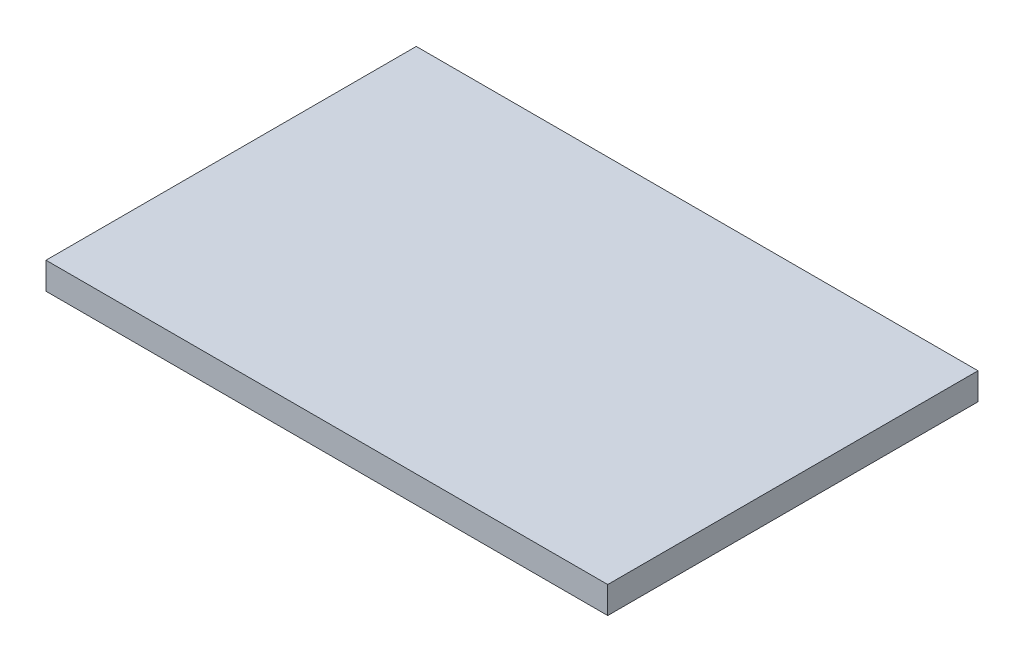
ISO-10303-21;
HEADER;
FILE_DESCRIPTION(('STEP AP214'),'2;1');
FILE_NAME('part.step','',(''),(''),'','','');
FILE_SCHEMA(('AUTOMOTIVE_DESIGN { 1 0 10303 214 1 1 1 1 }'));
ENDSEC;
DATA;
#1=APPLICATION_CONTEXT('core data for automotive mechanical design processes');
#2=APPLICATION_PROTOCOL_DEFINITION('international standard','automotive_design',2000,#1);
#3=PRODUCT_CONTEXT('',#1,'mechanical');
#4=PRODUCT('Part','Part','',(#3));
#5=PRODUCT_RELATED_PRODUCT_CATEGORY('part','',(#4));
#6=PRODUCT_DEFINITION_FORMATION('','',#4);
#7=PRODUCT_DEFINITION_CONTEXT('part definition',#1,'design');
#8=PRODUCT_DEFINITION('design','',#6,#7);
#9=PRODUCT_DEFINITION_SHAPE('','',#8);
#10=(LENGTH_UNIT() NAMED_UNIT(*) SI_UNIT(.MILLI.,.METRE.));
#11=(NAMED_UNIT(*) PLANE_ANGLE_UNIT() SI_UNIT($,.RADIAN.));
#12=(NAMED_UNIT(*) SI_UNIT($,.STERADIAN.) SOLID_ANGLE_UNIT());
#13=UNCERTAINTY_MEASURE_WITH_UNIT(LENGTH_MEASURE(1.E-05),#10,'distance_accuracy_value','');
#14=(GEOMETRIC_REPRESENTATION_CONTEXT(3) GLOBAL_UNCERTAINTY_ASSIGNED_CONTEXT((#13)) GLOBAL_UNIT_ASSIGNED_CONTEXT((#10,
#11,#12)) REPRESENTATION_CONTEXT('',''));
#15=CARTESIAN_POINT('',(0.,0.,0.));
#16=DIRECTION('',(0.,0.,1.));
#17=DIRECTION('',(1.,0.,0.));
#18=AXIS2_PLACEMENT_3D('',#15,#16,#17);
#19=CARTESIAN_POINT('',(0.,17.,0.));
#20=DIRECTION('',(1.,0.,0.));
#21=DIRECTION('',(0.,0.,-1.));
#22=AXIS2_PLACEMENT_3D('',#19,#20,#21);
#23=PLANE('',#22);
#24=DIRECTION('',(0.,0.,1.));
#25=VECTOR('',#24,1.);
#26=CARTESIAN_POINT('',(0.,0.,0.));
#27=LINE('',#26,#25);
#28=CARTESIAN_POINT('',(0.,0.,0.));
#29=VERTEX_POINT('',#28);
#30=CARTESIAN_POINT('',(0.,0.,234.));
#31=VERTEX_POINT('',#30);
#32=EDGE_CURVE('E100',#29,#31,#27,.T.);
#33=ORIENTED_EDGE('',*,*,#32,.T.);
#34=DIRECTION('',(0.,-1.,0.));
#35=VECTOR('',#34,1.);
#36=CARTESIAN_POINT('',(0.,17.,234.));
#37=LINE('',#36,#35);
#38=CARTESIAN_POINT('',(0.,17.,234.));
#39=VERTEX_POINT('',#38);
#40=EDGE_CURVE('E11',#39,#31,#37,.T.);
#41=ORIENTED_EDGE('',*,*,#40,.F.);
#42=DIRECTION('',(0.,0.,1.));
#43=VECTOR('',#42,1.);
#44=CARTESIAN_POINT('',(0.,17.,0.));
#45=LINE('',#44,#43);
#46=CARTESIAN_POINT('',(0.,17.,0.));
#47=VERTEX_POINT('',#46);
#48=EDGE_CURVE('E88',#47,#39,#45,.T.);
#49=ORIENTED_EDGE('',*,*,#48,.F.);
#50=DIRECTION('',(0.,-1.,0.));
#51=VECTOR('',#50,1.);
#52=CARTESIAN_POINT('',(0.,17.,0.));
#53=LINE('',#52,#51);
#54=EDGE_CURVE('E96',#47,#29,#53,.T.);
#55=ORIENTED_EDGE('',*,*,#54,.T.);
#56=EDGE_LOOP('',(#33,#41,#49,#55));
#57=FACE_BOUND('',#56,.T.);
#58=ADVANCED_FACE('F37',(#57),#23,.F.);
#59=CARTESIAN_POINT('',(0.,17.,234.));
#60=DIRECTION('',(0.,0.,-1.));
#61=DIRECTION('',(-1.,0.,0.));
#62=AXIS2_PLACEMENT_3D('',#59,#60,#61);
#63=PLANE('',#62);
#64=DIRECTION('',(1.,0.,0.));
#65=VECTOR('',#64,1.);
#66=CARTESIAN_POINT('',(0.,0.,234.));
#67=LINE('',#66,#65);
#68=CARTESIAN_POINT('',(355.,0.,234.));
#69=VERTEX_POINT('',#68);
#70=EDGE_CURVE('E92',#31,#69,#67,.T.);
#71=ORIENTED_EDGE('',*,*,#70,.T.);
#72=DIRECTION('',(0.,-1.,0.));
#73=VECTOR('',#72,1.);
#74=CARTESIAN_POINT('',(355.,17.,234.));
#75=LINE('',#74,#73);
#76=CARTESIAN_POINT('',(355.,17.,234.));
#77=VERTEX_POINT('',#76);
#78=EDGE_CURVE('E45',#77,#69,#75,.T.);
#79=ORIENTED_EDGE('',*,*,#78,.F.);
#80=DIRECTION('',(1.,0.,0.));
#81=VECTOR('',#80,1.);
#82=CARTESIAN_POINT('',(0.,17.,234.));
#83=LINE('',#82,#81);
#84=EDGE_CURVE('E83',#39,#77,#83,.T.);
#85=ORIENTED_EDGE('',*,*,#84,.F.);
#86=ORIENTED_EDGE('',*,*,#40,.T.);
#87=EDGE_LOOP('',(#71,#79,#85,#86));
#88=FACE_BOUND('',#87,.T.);
#89=ADVANCED_FACE('F91',(#88),#63,.F.);
#90=CARTESIAN_POINT('',(355.,17.,0.));
#91=DIRECTION('',(-1.,0.,0.));
#92=DIRECTION('',(0.,0.,1.));
#93=AXIS2_PLACEMENT_3D('',#90,#91,#92);
#94=PLANE('',#93);
#95=DIRECTION('',(0.,0.,-1.));
#96=VECTOR('',#95,1.);
#97=CARTESIAN_POINT('',(355.,0.,0.));
#98=LINE('',#97,#96);
#99=CARTESIAN_POINT('',(355.,0.,0.));
#100=VERTEX_POINT('',#99);
#101=EDGE_CURVE('E70',#69,#100,#98,.T.);
#102=ORIENTED_EDGE('',*,*,#101,.T.);
#103=DIRECTION('',(0.,-1.,0.));
#104=VECTOR('',#103,1.);
#105=CARTESIAN_POINT('',(355.,17.,0.));
#106=LINE('',#105,#104);
#107=CARTESIAN_POINT('',(355.,17.,0.));
#108=VERTEX_POINT('',#107);
#109=EDGE_CURVE('E93',#108,#100,#106,.T.);
#110=ORIENTED_EDGE('',*,*,#109,.F.);
#111=DIRECTION('',(0.,0.,-1.));
#112=VECTOR('',#111,1.);
#113=CARTESIAN_POINT('',(355.,17.,0.));
#114=LINE('',#113,#112);
#115=EDGE_CURVE('E86',#77,#108,#114,.T.);
#116=ORIENTED_EDGE('',*,*,#115,.F.);
#117=ORIENTED_EDGE('',*,*,#78,.T.);
#118=EDGE_LOOP('',(#102,#110,#116,#117));
#119=FACE_BOUND('',#118,.T.);
#120=ADVANCED_FACE('F94',(#119),#94,.F.);
#121=CARTESIAN_POINT('',(0.,17.,0.));
#122=DIRECTION('',(0.,0.,1.));
#123=DIRECTION('',(1.,0.,0.));
#124=AXIS2_PLACEMENT_3D('',#121,#122,#123);
#125=PLANE('',#124);
#126=DIRECTION('',(-1.,0.,0.));
#127=VECTOR('',#126,1.);
#128=CARTESIAN_POINT('',(0.,0.,0.));
#129=LINE('',#128,#127);
#130=EDGE_CURVE('E76',#100,#29,#129,.T.);
#131=ORIENTED_EDGE('',*,*,#130,.T.);
#132=ORIENTED_EDGE('',*,*,#54,.F.);
#133=DIRECTION('',(-1.,0.,0.));
#134=VECTOR('',#133,1.);
#135=CARTESIAN_POINT('',(0.,17.,0.));
#136=LINE('',#135,#134);
#137=EDGE_CURVE('E53',#108,#47,#136,.T.);
#138=ORIENTED_EDGE('',*,*,#137,.F.);
#139=ORIENTED_EDGE('',*,*,#109,.T.);
#140=EDGE_LOOP('',(#131,#132,#138,#139));
#141=FACE_BOUND('',#140,.T.);
#142=ADVANCED_FACE('F107',(#141),#125,.F.);
#143=CARTESIAN_POINT('',(0.,17.,0.));
#144=DIRECTION('',(0.,1.,0.));
#145=DIRECTION('',(0.,0.,1.));
#146=AXIS2_PLACEMENT_3D('',#143,#144,#145);
#147=PLANE('',#146);
#148=ORIENTED_EDGE('',*,*,#48,.T.);
#149=ORIENTED_EDGE('',*,*,#84,.T.);
#150=ORIENTED_EDGE('',*,*,#115,.T.);
#151=ORIENTED_EDGE('',*,*,#137,.T.);
#152=EDGE_LOOP('',(#148,#149,#150,#151));
#153=FACE_BOUND('',#152,.T.);
#154=ADVANCED_FACE('F84',(#153),#147,.T.);
#155=CARTESIAN_POINT('',(0.,0.,0.));
#156=DIRECTION('',(0.,1.,0.));
#157=DIRECTION('',(0.,0.,1.));
#158=AXIS2_PLACEMENT_3D('',#155,#156,#157);
#159=PLANE('',#158);
#160=ORIENTED_EDGE('',*,*,#32,.F.);
#161=ORIENTED_EDGE('',*,*,#130,.F.);
#162=ORIENTED_EDGE('',*,*,#101,.F.);
#163=ORIENTED_EDGE('',*,*,#70,.F.);
#164=EDGE_LOOP('',(#160,#161,#162,#163));
#165=FACE_BOUND('',#164,.T.);
#166=ADVANCED_FACE('F110',(#165),#159,.F.);
#167=CLOSED_SHELL('',(#58,#89,#120,#142,#154,#166));
#168=MANIFOLD_SOLID_BREP('B2',#167);
#169=ADVANCED_BREP_SHAPE_REPRESENTATION('',(#18,#168),#14);
#170=SHAPE_DEFINITION_REPRESENTATION(#9,#169);
ENDSEC;
END-ISO-10303-21;
